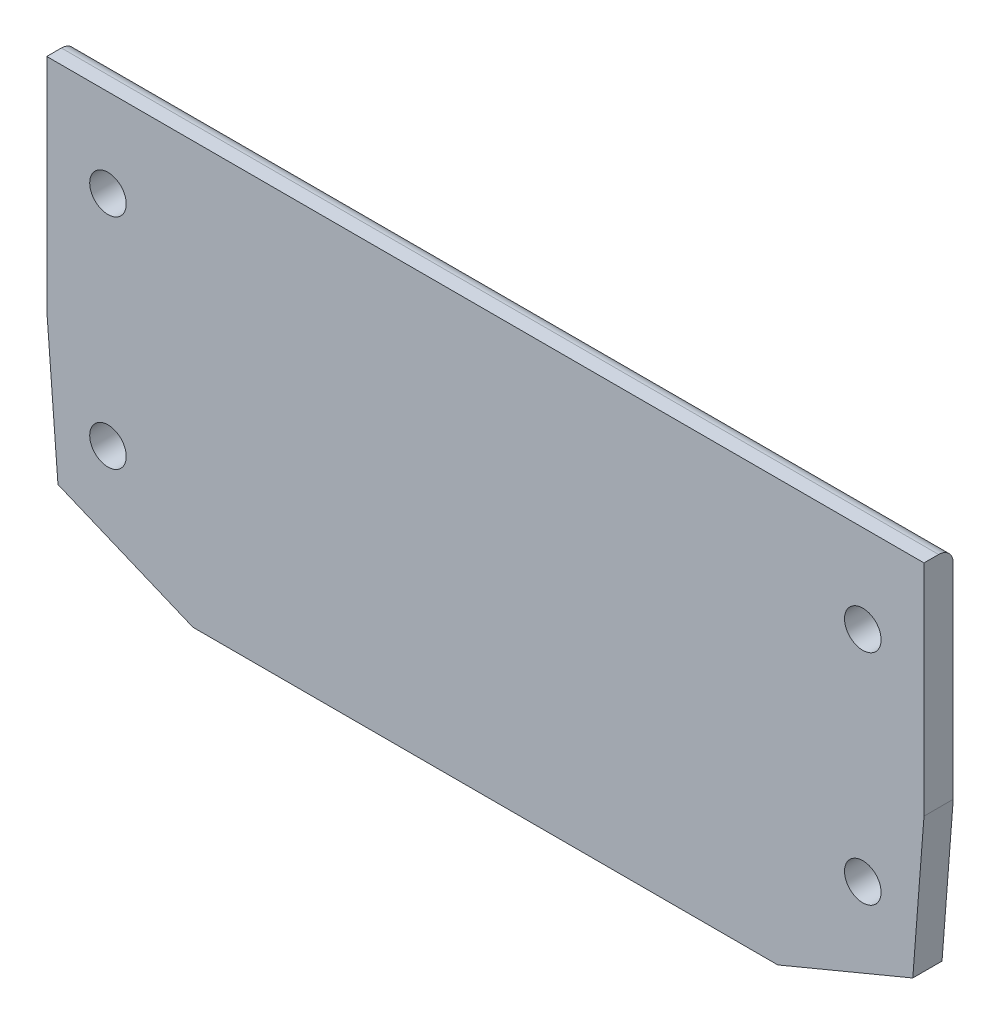
ISO-10303-21;
HEADER;
FILE_DESCRIPTION(('STEP AP214'),'2;1');
FILE_NAME('part.step','',(''),(''),'','','');
FILE_SCHEMA(('AUTOMOTIVE_DESIGN { 1 0 10303 214 1 1 1 1 }'));
ENDSEC;
DATA;
#1=APPLICATION_CONTEXT('core data for automotive mechanical design processes');
#2=APPLICATION_PROTOCOL_DEFINITION('international standard','automotive_design',2000,#1);
#3=PRODUCT_CONTEXT('',#1,'mechanical');
#4=PRODUCT('Part','Part','',(#3));
#5=PRODUCT_RELATED_PRODUCT_CATEGORY('part','',(#4));
#6=PRODUCT_DEFINITION_FORMATION('','',#4);
#7=PRODUCT_DEFINITION_CONTEXT('part definition',#1,'design');
#8=PRODUCT_DEFINITION('design','',#6,#7);
#9=PRODUCT_DEFINITION_SHAPE('','',#8);
#10=(LENGTH_UNIT() NAMED_UNIT(*) SI_UNIT(.MILLI.,.METRE.));
#11=(NAMED_UNIT(*) PLANE_ANGLE_UNIT() SI_UNIT($,.RADIAN.));
#12=(NAMED_UNIT(*) SI_UNIT($,.STERADIAN.) SOLID_ANGLE_UNIT());
#13=UNCERTAINTY_MEASURE_WITH_UNIT(LENGTH_MEASURE(1.E-05),#10,'distance_accuracy_value','');
#14=(GEOMETRIC_REPRESENTATION_CONTEXT(3) GLOBAL_UNCERTAINTY_ASSIGNED_CONTEXT((#13)) GLOBAL_UNIT_ASSIGNED_CONTEXT((#10,
#11,#12)) REPRESENTATION_CONTEXT('',''));
#15=CARTESIAN_POINT('',(0.,0.,0.));
#16=DIRECTION('',(0.,0.,1.));
#17=DIRECTION('',(1.,0.,0.));
#18=AXIS2_PLACEMENT_3D('',#15,#16,#17);
#19=CARTESIAN_POINT('',(0.,0.,2.));
#20=DIRECTION('',(1.,0.,0.));
#21=DIRECTION('',(0.,1.,0.));
#22=AXIS2_PLACEMENT_3D('',#19,#20,#21);
#23=PLANE('',#22);
#24=DIRECTION('',(0.,0.,-1.));
#25=VECTOR('',#24,1.);
#26=CARTESIAN_POINT('',(0.,0.,2.));
#27=LINE('',#26,#25);
#28=CARTESIAN_POINT('',(0.,0.,2.));
#29=VERTEX_POINT('',#28);
#30=CARTESIAN_POINT('',(0.,0.,1.));
#31=VERTEX_POINT('',#30);
#32=EDGE_CURVE('E152',#29,#31,#27,.T.);
#33=ORIENTED_EDGE('',*,*,#32,.T.);
#34=CARTESIAN_POINT('',(0.,-1.,1.));
#35=DIRECTION('',(1.,0.,0.));
#36=DIRECTION('',(0.,1.,0.));
#37=AXIS2_PLACEMENT_3D('',#34,#35,#36);
#38=CIRCLE('',#37,1.);
#39=CARTESIAN_POINT('',(0.,-1.,0.));
#40=VERTEX_POINT('',#39);
#41=EDGE_CURVE('E61',#31,#40,#38,.F.);
#42=ORIENTED_EDGE('',*,*,#41,.T.);
#43=DIRECTION('',(0.,-1.,0.));
#44=VECTOR('',#43,1.);
#45=CARTESIAN_POINT('',(0.,0.,0.));
#46=LINE('',#45,#44);
#47=CARTESIAN_POINT('',(0.,-15.,0.));
#48=VERTEX_POINT('',#47);
#49=EDGE_CURVE('E128',#40,#48,#46,.T.);
#50=ORIENTED_EDGE('',*,*,#49,.T.);
#51=DIRECTION('',(0.,0.,-1.));
#52=VECTOR('',#51,1.);
#53=CARTESIAN_POINT('',(0.,-15.,2.));
#54=LINE('',#53,#52);
#55=CARTESIAN_POINT('',(0.,-15.,2.));
#56=VERTEX_POINT('',#55);
#57=EDGE_CURVE('E113',#56,#48,#54,.T.);
#58=ORIENTED_EDGE('',*,*,#57,.F.);
#59=DIRECTION('',(0.,-1.,0.));
#60=VECTOR('',#59,1.);
#61=CARTESIAN_POINT('',(0.,0.,2.));
#62=LINE('',#61,#60);
#63=EDGE_CURVE('E119',#29,#56,#62,.T.);
#64=ORIENTED_EDGE('',*,*,#63,.F.);
#65=EDGE_LOOP('',(#33,#42,#50,#58,#64));
#66=FACE_BOUND('',#65,.T.);
#67=ADVANCED_FACE('F39',(#66),#23,.F.);
#68=CARTESIAN_POINT('',(0.,-15.,2.));
#69=DIRECTION('',(0.99705275222692,0.0767190281268194,0.));
#70=DIRECTION('',(-0.0767190281268194,0.99705275222692,0.));
#71=AXIS2_PLACEMENT_3D('',#68,#69,#70);
#72=PLANE('',#71);
#73=DIRECTION('',(0.0767190281268194,-0.99705275222692,0.));
#74=VECTOR('',#73,1.);
#75=CARTESIAN_POINT('',(0.,-15.,0.));
#76=LINE('',#75,#74);
#77=CARTESIAN_POINT('',(0.767190281268196,-24.9705275222692,0.));
#78=VERTEX_POINT('',#77);
#79=EDGE_CURVE('E163',#48,#78,#76,.T.);
#80=ORIENTED_EDGE('',*,*,#79,.T.);
#81=DIRECTION('',(0.,0.,-1.));
#82=VECTOR('',#81,1.);
#83=CARTESIAN_POINT('',(0.767190281268196,-24.9705275222692,2.));
#84=LINE('',#83,#82);
#85=CARTESIAN_POINT('',(0.767190281268196,-24.9705275222692,2.));
#86=VERTEX_POINT('',#85);
#87=EDGE_CURVE('E115',#86,#78,#84,.T.);
#88=ORIENTED_EDGE('',*,*,#87,.F.);
#89=DIRECTION('',(0.0767190281268194,-0.99705275222692,0.));
#90=VECTOR('',#89,1.);
#91=CARTESIAN_POINT('',(0.,-15.,2.));
#92=LINE('',#91,#90);
#93=EDGE_CURVE('E109',#56,#86,#92,.T.);
#94=ORIENTED_EDGE('',*,*,#93,.F.);
#95=ORIENTED_EDGE('',*,*,#57,.T.);
#96=EDGE_LOOP('',(#80,#88,#94,#95));
#97=FACE_BOUND('',#96,.T.);
#98=ADVANCED_FACE('F111',(#97),#72,.F.);
#99=CARTESIAN_POINT('',(0.767190281268196,-24.9705275222692,2.));
#100=DIRECTION('',(0.384295322659801,0.923210217112982,0.));
#101=DIRECTION('',(-0.923210217112982,0.384295322659801,0.));
#102=AXIS2_PLACEMENT_3D('',#99,#100,#101);
#103=PLANE('',#102);
#104=DIRECTION('',(0.923210217112982,-0.384295322659801,0.));
#105=VECTOR('',#104,1.);
#106=CARTESIAN_POINT('',(0.767190281268196,-24.9705275222692,0.));
#107=LINE('',#106,#105);
#108=CARTESIAN_POINT('',(9.99929245239802,-28.8134807488672,0.));
#109=VERTEX_POINT('',#108);
#110=EDGE_CURVE('E161',#78,#109,#107,.T.);
#111=ORIENTED_EDGE('',*,*,#110,.T.);
#112=DIRECTION('',(0.,0.,-1.));
#113=VECTOR('',#112,1.);
#114=CARTESIAN_POINT('',(9.99929245239802,-28.8134807488672,2.));
#115=LINE('',#114,#113);
#116=CARTESIAN_POINT('',(9.99929245239802,-28.8134807488672,2.));
#117=VERTEX_POINT('',#116);
#118=EDGE_CURVE('E134',#117,#109,#115,.T.);
#119=ORIENTED_EDGE('',*,*,#118,.F.);
#120=DIRECTION('',(0.923210217112982,-0.384295322659801,0.));
#121=VECTOR('',#120,1.);
#122=CARTESIAN_POINT('',(0.767190281268196,-24.9705275222692,2.));
#123=LINE('',#122,#121);
#124=EDGE_CURVE('E118',#86,#117,#123,.T.);
#125=ORIENTED_EDGE('',*,*,#124,.F.);
#126=ORIENTED_EDGE('',*,*,#87,.T.);
#127=EDGE_LOOP('',(#111,#119,#125,#126));
#128=FACE_BOUND('',#127,.T.);
#129=ADVANCED_FACE('F243',(#128),#103,.F.);
#130=CARTESIAN_POINT('',(9.99929245239802,-28.8134807488672,2.));
#131=DIRECTION('',(0.,1.,0.));
#132=DIRECTION('',(-1.,0.,0.));
#133=AXIS2_PLACEMENT_3D('',#130,#131,#132);
#134=PLANE('',#133);
#135=DIRECTION('',(1.,0.,0.));
#136=VECTOR('',#135,1.);
#137=CARTESIAN_POINT('',(9.99929245239802,-28.8134807488672,0.));
#138=LINE('',#137,#136);
#139=CARTESIAN_POINT('',(50.0007075476025,-28.8134807488676,0.));
#140=VERTEX_POINT('',#139);
#141=EDGE_CURVE('E159',#109,#140,#138,.T.);
#142=ORIENTED_EDGE('',*,*,#141,.T.);
#143=DIRECTION('',(0.,0.,-1.));
#144=VECTOR('',#143,1.);
#145=CARTESIAN_POINT('',(50.0007075476025,-28.8134807488676,2.));
#146=LINE('',#145,#144);
#147=CARTESIAN_POINT('',(50.0007075476025,-28.8134807488676,2.));
#148=VERTEX_POINT('',#147);
#149=EDGE_CURVE('E140',#148,#140,#146,.T.);
#150=ORIENTED_EDGE('',*,*,#149,.F.);
#151=DIRECTION('',(1.,0.,0.));
#152=VECTOR('',#151,1.);
#153=CARTESIAN_POINT('',(9.99929245239802,-28.8134807488672,2.));
#154=LINE('',#153,#152);
#155=EDGE_CURVE('E174',#117,#148,#154,.T.);
#156=ORIENTED_EDGE('',*,*,#155,.F.);
#157=ORIENTED_EDGE('',*,*,#118,.T.);
#158=EDGE_LOOP('',(#142,#150,#156,#157));
#159=FACE_BOUND('',#158,.T.);
#160=ADVANCED_FACE('F248',(#159),#134,.F.);
#161=CARTESIAN_POINT('',(50.0007075476025,-28.8134807488676,2.));
#162=DIRECTION('',(-0.384295322659838,0.923210217112967,0.));
#163=DIRECTION('',(-0.923210217112967,-0.384295322659838,0.));
#164=AXIS2_PLACEMENT_3D('',#161,#162,#163);
#165=PLANE('',#164);
#166=DIRECTION('',(0.923210217112967,0.384295322659838,0.));
#167=VECTOR('',#166,1.);
#168=CARTESIAN_POINT('',(50.0007075476025,-28.8134807488676,0.));
#169=LINE('',#168,#167);
#170=CARTESIAN_POINT('',(59.2328097187322,-24.9705275222692,0.));
#171=VERTEX_POINT('',#170);
#172=EDGE_CURVE('E157',#140,#171,#169,.T.);
#173=ORIENTED_EDGE('',*,*,#172,.T.);
#174=DIRECTION('',(0.,0.,-1.));
#175=VECTOR('',#174,1.);
#176=CARTESIAN_POINT('',(59.2328097187322,-24.9705275222692,2.));
#177=LINE('',#176,#175);
#178=CARTESIAN_POINT('',(59.2328097187322,-24.9705275222692,2.));
#179=VERTEX_POINT('',#178);
#180=EDGE_CURVE('E143',#179,#171,#177,.T.);
#181=ORIENTED_EDGE('',*,*,#180,.F.);
#182=DIRECTION('',(0.923210217112967,0.384295322659838,0.));
#183=VECTOR('',#182,1.);
#184=CARTESIAN_POINT('',(50.0007075476025,-28.8134807488676,2.));
#185=LINE('',#184,#183);
#186=EDGE_CURVE('E172',#148,#179,#185,.T.);
#187=ORIENTED_EDGE('',*,*,#186,.F.);
#188=ORIENTED_EDGE('',*,*,#149,.T.);
#189=EDGE_LOOP('',(#173,#181,#187,#188));
#190=FACE_BOUND('',#189,.T.);
#191=ADVANCED_FACE('F252',(#190),#165,.F.);
#192=CARTESIAN_POINT('',(60.,-15.,2.));
#193=DIRECTION('',(-0.997052752226923,0.0767190281267787,0.));
#194=DIRECTION('',(-0.0767190281267787,-0.997052752226923,0.));
#195=AXIS2_PLACEMENT_3D('',#192,#193,#194);
#196=PLANE('',#195);
#197=DIRECTION('',(0.0767190281267787,0.997052752226923,0.));
#198=VECTOR('',#197,1.);
#199=CARTESIAN_POINT('',(60.,-15.,0.));
#200=LINE('',#199,#198);
#201=CARTESIAN_POINT('',(60.,-15.,0.));
#202=VERTEX_POINT('',#201);
#203=EDGE_CURVE('E155',#171,#202,#200,.T.);
#204=ORIENTED_EDGE('',*,*,#203,.T.);
#205=DIRECTION('',(0.,0.,-1.));
#206=VECTOR('',#205,1.);
#207=CARTESIAN_POINT('',(60.,-15.,2.));
#208=LINE('',#207,#206);
#209=CARTESIAN_POINT('',(60.,-15.,2.));
#210=VERTEX_POINT('',#209);
#211=EDGE_CURVE('E146',#210,#202,#208,.T.);
#212=ORIENTED_EDGE('',*,*,#211,.F.);
#213=DIRECTION('',(0.0767190281267787,0.997052752226923,0.));
#214=VECTOR('',#213,1.);
#215=CARTESIAN_POINT('',(60.,-15.,2.));
#216=LINE('',#215,#214);
#217=EDGE_CURVE('E170',#179,#210,#216,.T.);
#218=ORIENTED_EDGE('',*,*,#217,.F.);
#219=ORIENTED_EDGE('',*,*,#180,.T.);
#220=EDGE_LOOP('',(#204,#212,#218,#219));
#221=FACE_BOUND('',#220,.T.);
#222=ADVANCED_FACE('F237',(#221),#196,.F.);
#223=CARTESIAN_POINT('',(60.,0.,2.));
#224=DIRECTION('',(-1.,0.,0.));
#225=DIRECTION('',(0.,0.,1.));
#226=AXIS2_PLACEMENT_3D('',#223,#224,#225);
#227=PLANE('',#226);
#228=DIRECTION('',(0.,1.,0.));
#229=VECTOR('',#228,1.);
#230=CARTESIAN_POINT('',(60.,0.,0.));
#231=LINE('',#230,#229);
#232=CARTESIAN_POINT('',(60.,-0.999999999999997,0.));
#233=VERTEX_POINT('',#232);
#234=EDGE_CURVE('E126',#202,#233,#231,.T.);
#235=ORIENTED_EDGE('',*,*,#234,.T.);
#236=CARTESIAN_POINT('',(60.,-0.999999999999998,1.));
#237=DIRECTION('',(-1.,0.,0.));
#238=DIRECTION('',(0.,0.,1.));
#239=AXIS2_PLACEMENT_3D('',#236,#237,#238);
#240=CIRCLE('',#239,1.);
#241=CARTESIAN_POINT('',(60.,0.,1.));
#242=VERTEX_POINT('',#241);
#243=EDGE_CURVE('E11',#233,#242,#240,.F.);
#244=ORIENTED_EDGE('',*,*,#243,.T.);
#245=DIRECTION('',(0.,0.,-1.));
#246=VECTOR('',#245,1.);
#247=CARTESIAN_POINT('',(60.,0.,2.));
#248=LINE('',#247,#246);
#249=CARTESIAN_POINT('',(60.,0.,2.));
#250=VERTEX_POINT('',#249);
#251=EDGE_CURVE('E149',#250,#242,#248,.T.);
#252=ORIENTED_EDGE('',*,*,#251,.F.);
#253=DIRECTION('',(0.,1.,0.));
#254=VECTOR('',#253,1.);
#255=CARTESIAN_POINT('',(60.,0.,2.));
#256=LINE('',#255,#254);
#257=EDGE_CURVE('E168',#210,#250,#256,.T.);
#258=ORIENTED_EDGE('',*,*,#257,.F.);
#259=ORIENTED_EDGE('',*,*,#211,.T.);
#260=EDGE_LOOP('',(#235,#244,#252,#258,#259));
#261=FACE_BOUND('',#260,.T.);
#262=ADVANCED_FACE('F226',(#261),#227,.F.);
#263=CARTESIAN_POINT('',(60.,0.,2.));
#264=DIRECTION('',(0.,-1.,0.));
#265=DIRECTION('',(1.,0.,0.));
#266=AXIS2_PLACEMENT_3D('',#263,#264,#265);
#267=PLANE('',#266);
#268=ORIENTED_EDGE('',*,*,#251,.T.);
#269=DIRECTION('',(-1.,0.,0.));
#270=VECTOR('',#269,1.);
#271=CARTESIAN_POINT('',(60.,0.,1.));
#272=LINE('',#271,#270);
#273=EDGE_CURVE('E130',#242,#31,#272,.T.);
#274=ORIENTED_EDGE('',*,*,#273,.T.);
#275=ORIENTED_EDGE('',*,*,#32,.F.);
#276=DIRECTION('',(-1.,0.,0.));
#277=VECTOR('',#276,1.);
#278=CARTESIAN_POINT('',(60.,0.,2.));
#279=LINE('',#278,#277);
#280=EDGE_CURVE('E124',#250,#29,#279,.T.);
#281=ORIENTED_EDGE('',*,*,#280,.F.);
#282=EDGE_LOOP('',(#268,#274,#275,#281));
#283=FACE_BOUND('',#282,.T.);
#284=ADVANCED_FACE('F229',(#283),#267,.F.);
#285=CARTESIAN_POINT('',(0.,0.,2.));
#286=DIRECTION('',(0.,0.,1.));
#287=DIRECTION('',(1.,0.,0.));
#288=AXIS2_PLACEMENT_3D('',#285,#286,#287);
#289=PLANE('',#288);
#290=CARTESIAN_POINT('',(55.8133336218582,-6.02196656163609,2.));
#291=DIRECTION('',(0.,0.,-1.));
#292=DIRECTION('',(1.,0.,0.));
#293=AXIS2_PLACEMENT_3D('',#290,#291,#292);
#294=CIRCLE('',#293,1.25);
#295=CARTESIAN_POINT('',(57.0633336218582,-6.02196656163609,2.));
#296=VERTEX_POINT('',#295);
#297=EDGE_CURVE('E192',#296,#296,#294,.T.);
#298=ORIENTED_EDGE('',*,*,#297,.T.);
#299=EDGE_LOOP('',(#298));
#300=FACE_BOUND('',#299,.T.);
#301=CARTESIAN_POINT('',(4.18666637814176,-6.02196656163609,2.));
#302=DIRECTION('',(0.,0.,1.));
#303=DIRECTION('',(-1.,0.,0.));
#304=AXIS2_PLACEMENT_3D('',#301,#302,#303);
#305=CIRCLE('',#304,1.25);
#306=CARTESIAN_POINT('',(2.93666637814176,-6.02196656163609,2.));
#307=VERTEX_POINT('',#306);
#308=EDGE_CURVE('E186',#307,#307,#305,.T.);
#309=ORIENTED_EDGE('',*,*,#308,.F.);
#310=EDGE_LOOP('',(#309));
#311=FACE_BOUND('',#310,.T.);
#312=CARTESIAN_POINT('',(55.8133336218582,-20.9780334383639,2.));
#313=DIRECTION('',(0.,0.,1.));
#314=DIRECTION('',(1.,0.,0.));
#315=AXIS2_PLACEMENT_3D('',#312,#313,#314);
#316=CIRCLE('',#315,1.25);
#317=CARTESIAN_POINT('',(57.0633336218582,-20.9780334383639,2.));
#318=VERTEX_POINT('',#317);
#319=EDGE_CURVE('E180',#318,#318,#316,.T.);
#320=ORIENTED_EDGE('',*,*,#319,.F.);
#321=EDGE_LOOP('',(#320));
#322=FACE_BOUND('',#321,.T.);
#323=CARTESIAN_POINT('',(4.18666637814176,-20.9780334383639,2.));
#324=DIRECTION('',(0.,0.,-1.));
#325=DIRECTION('',(-1.,0.,0.));
#326=AXIS2_PLACEMENT_3D('',#323,#324,#325);
#327=CIRCLE('',#326,1.25);
#328=CARTESIAN_POINT('',(2.93666637814176,-20.9780334383639,2.));
#329=VERTEX_POINT('',#328);
#330=EDGE_CURVE('E166',#329,#329,#327,.T.);
#331=ORIENTED_EDGE('',*,*,#330,.T.);
#332=EDGE_LOOP('',(#331));
#333=FACE_BOUND('',#332,.T.);
#334=ORIENTED_EDGE('',*,*,#63,.T.);
#335=ORIENTED_EDGE('',*,*,#93,.T.);
#336=ORIENTED_EDGE('',*,*,#124,.T.);
#337=ORIENTED_EDGE('',*,*,#155,.T.);
#338=ORIENTED_EDGE('',*,*,#186,.T.);
#339=ORIENTED_EDGE('',*,*,#217,.T.);
#340=ORIENTED_EDGE('',*,*,#257,.T.);
#341=ORIENTED_EDGE('',*,*,#280,.T.);
#342=EDGE_LOOP('',(#334,#335,#336,#337,#338,#339,#340,#341));
#343=FACE_BOUND('',#342,.T.);
#344=ADVANCED_FACE('F122',(#300,#311,#322,#333,#343),#289,.T.);
#345=CARTESIAN_POINT('',(0.,0.,0.));
#346=DIRECTION('',(0.,0.,1.));
#347=DIRECTION('',(1.,0.,0.));
#348=AXIS2_PLACEMENT_3D('',#345,#346,#347);
#349=PLANE('',#348);
#350=CARTESIAN_POINT('',(55.8133336218582,-6.02196656163609,0.));
#351=DIRECTION('',(0.,0.,-1.));
#352=DIRECTION('',(1.,0.,0.));
#353=AXIS2_PLACEMENT_3D('',#350,#351,#352);
#354=CIRCLE('',#353,1.25);
#355=CARTESIAN_POINT('',(57.0633336218582,-6.02196656163609,0.));
#356=VERTEX_POINT('',#355);
#357=EDGE_CURVE('E195',#356,#356,#354,.T.);
#358=ORIENTED_EDGE('',*,*,#357,.F.);
#359=EDGE_LOOP('',(#358));
#360=FACE_BOUND('',#359,.T.);
#361=CARTESIAN_POINT('',(4.18666637814176,-6.02196656163609,0.));
#362=DIRECTION('',(0.,0.,1.));
#363=DIRECTION('',(-1.,0.,0.));
#364=AXIS2_PLACEMENT_3D('',#361,#362,#363);
#365=CIRCLE('',#364,1.25);
#366=CARTESIAN_POINT('',(2.93666637814176,-6.02196656163609,0.));
#367=VERTEX_POINT('',#366);
#368=EDGE_CURVE('E189',#367,#367,#365,.T.);
#369=ORIENTED_EDGE('',*,*,#368,.T.);
#370=EDGE_LOOP('',(#369));
#371=FACE_BOUND('',#370,.T.);
#372=CARTESIAN_POINT('',(55.8133336218582,-20.9780334383639,0.));
#373=DIRECTION('',(0.,0.,1.));
#374=DIRECTION('',(1.,0.,0.));
#375=AXIS2_PLACEMENT_3D('',#372,#373,#374);
#376=CIRCLE('',#375,1.25);
#377=CARTESIAN_POINT('',(57.0633336218582,-20.9780334383639,0.));
#378=VERTEX_POINT('',#377);
#379=EDGE_CURVE('E183',#378,#378,#376,.T.);
#380=ORIENTED_EDGE('',*,*,#379,.T.);
#381=EDGE_LOOP('',(#380));
#382=FACE_BOUND('',#381,.T.);
#383=CARTESIAN_POINT('',(4.18666637814176,-20.9780334383639,0.));
#384=DIRECTION('',(0.,0.,-1.));
#385=DIRECTION('',(-1.,0.,0.));
#386=AXIS2_PLACEMENT_3D('',#383,#384,#385);
#387=CIRCLE('',#386,1.25);
#388=CARTESIAN_POINT('',(2.93666637814176,-20.9780334383639,0.));
#389=VERTEX_POINT('',#388);
#390=EDGE_CURVE('E177',#389,#389,#387,.T.);
#391=ORIENTED_EDGE('',*,*,#390,.F.);
#392=EDGE_LOOP('',(#391));
#393=FACE_BOUND('',#392,.T.);
#394=ORIENTED_EDGE('',*,*,#49,.F.);
#395=DIRECTION('',(-1.,0.,0.));
#396=VECTOR('',#395,1.);
#397=CARTESIAN_POINT('',(0.,-1.,0.));
#398=LINE('',#397,#396);
#399=EDGE_CURVE('E47',#40,#233,#398,.F.);
#400=ORIENTED_EDGE('',*,*,#399,.T.);
#401=ORIENTED_EDGE('',*,*,#234,.F.);
#402=ORIENTED_EDGE('',*,*,#203,.F.);
#403=ORIENTED_EDGE('',*,*,#172,.F.);
#404=ORIENTED_EDGE('',*,*,#141,.F.);
#405=ORIENTED_EDGE('',*,*,#110,.F.);
#406=ORIENTED_EDGE('',*,*,#79,.F.);
#407=EDGE_LOOP('',(#394,#400,#401,#402,#403,#404,#405,#406));
#408=FACE_BOUND('',#407,.T.);
#409=ADVANCED_FACE('F210',(#360,#371,#382,#393,#408),#349,.F.);
#410=CARTESIAN_POINT('',(4.18666637814176,-20.9780334383639,2.));
#411=DIRECTION('',(0.,0.,-1.));
#412=DIRECTION('',(-1.,0.,0.));
#413=AXIS2_PLACEMENT_3D('',#410,#411,#412);
#414=CYLINDRICAL_SURFACE('',#413,1.25);
#415=ORIENTED_EDGE('',*,*,#330,.F.);
#416=EDGE_LOOP('',(#415));
#417=FACE_BOUND('',#416,.T.);
#418=ORIENTED_EDGE('',*,*,#390,.T.);
#419=EDGE_LOOP('',(#418));
#420=FACE_BOUND('',#419,.T.);
#421=ADVANCED_FACE('F213',(#417,#420),#414,.F.);
#422=CARTESIAN_POINT('',(55.8133336218582,-20.9780334383639,2.));
#423=DIRECTION('',(0.,0.,-1.));
#424=DIRECTION('',(-1.,0.,0.));
#425=AXIS2_PLACEMENT_3D('',#422,#423,#424);
#426=CYLINDRICAL_SURFACE('',#425,1.25);
#427=ORIENTED_EDGE('',*,*,#319,.T.);
#428=EDGE_LOOP('',(#427));
#429=FACE_BOUND('',#428,.T.);
#430=ORIENTED_EDGE('',*,*,#379,.F.);
#431=EDGE_LOOP('',(#430));
#432=FACE_BOUND('',#431,.T.);
#433=ADVANCED_FACE('F281',(#429,#432),#426,.F.);
#434=CARTESIAN_POINT('',(4.18666637814176,-6.02196656163609,2.));
#435=DIRECTION('',(0.,0.,-1.));
#436=DIRECTION('',(-1.,0.,0.));
#437=AXIS2_PLACEMENT_3D('',#434,#435,#436);
#438=CYLINDRICAL_SURFACE('',#437,1.25);
#439=ORIENTED_EDGE('',*,*,#308,.T.);
#440=EDGE_LOOP('',(#439));
#441=FACE_BOUND('',#440,.T.);
#442=ORIENTED_EDGE('',*,*,#368,.F.);
#443=EDGE_LOOP('',(#442));
#444=FACE_BOUND('',#443,.T.);
#445=ADVANCED_FACE('F206',(#441,#444),#438,.F.);
#446=CARTESIAN_POINT('',(55.8133336218582,-6.02196656163609,2.));
#447=DIRECTION('',(0.,0.,-1.));
#448=DIRECTION('',(-1.,0.,0.));
#449=AXIS2_PLACEMENT_3D('',#446,#447,#448);
#450=CYLINDRICAL_SURFACE('',#449,1.25);
#451=ORIENTED_EDGE('',*,*,#297,.F.);
#452=EDGE_LOOP('',(#451));
#453=FACE_BOUND('',#452,.T.);
#454=ORIENTED_EDGE('',*,*,#357,.T.);
#455=EDGE_LOOP('',(#454));
#456=FACE_BOUND('',#455,.T.);
#457=ADVANCED_FACE('F203',(#453,#456),#450,.F.);
#458=CARTESIAN_POINT('',(60.,-0.999999999999998,1.));
#459=DIRECTION('',(-1.,0.,0.));
#460=DIRECTION('',(0.,-1.,0.));
#461=AXIS2_PLACEMENT_3D('',#458,#459,#460);
#462=CYLINDRICAL_SURFACE('',#461,1.);
#463=ORIENTED_EDGE('',*,*,#243,.F.);
#464=ORIENTED_EDGE('',*,*,#399,.F.);
#465=ORIENTED_EDGE('',*,*,#41,.F.);
#466=ORIENTED_EDGE('',*,*,#273,.F.);
#467=EDGE_LOOP('',(#463,#464,#465,#466));
#468=FACE_BOUND('',#467,.T.);
#469=ADVANCED_FACE('F41',(#468),#462,.T.);
#470=CLOSED_SHELL('',(#67,#98,#129,#160,#191,#222,#262,#284,#344,#409,#421,#433,#445,#457,#469));
#471=MANIFOLD_SOLID_BREP('B2',#470);
#472=ADVANCED_BREP_SHAPE_REPRESENTATION('',(#18,#471),#14);
#473=SHAPE_DEFINITION_REPRESENTATION(#9,#472);
ENDSEC;
END-ISO-10303-21;
